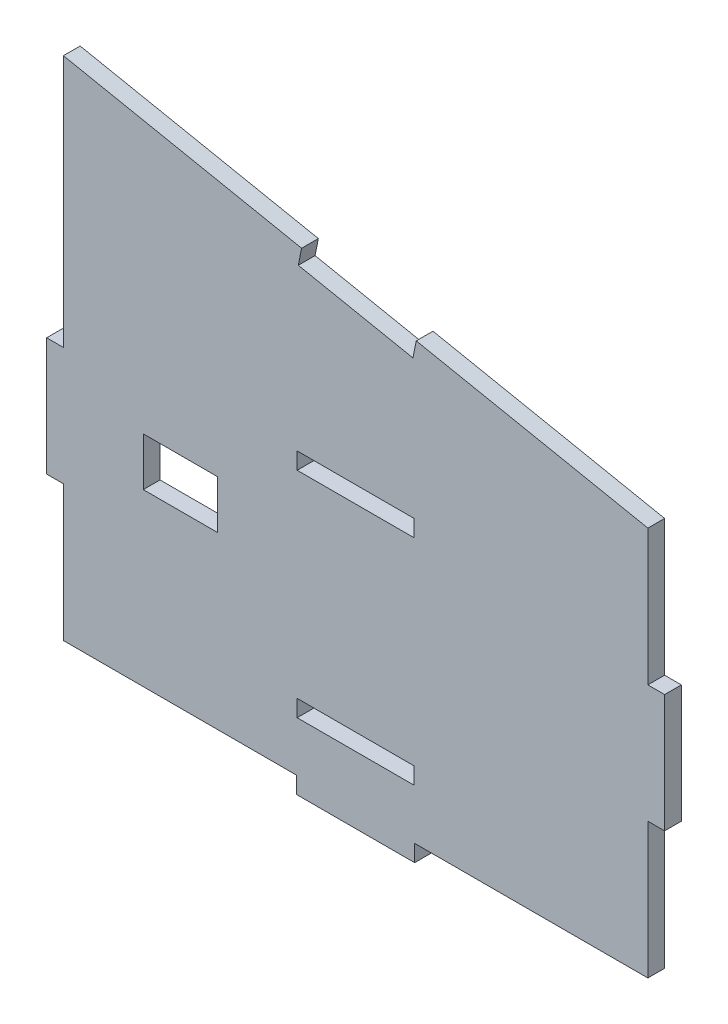
ISO-10303-21;
HEADER;
FILE_DESCRIPTION(('STEP AP214'),'2;1');
FILE_NAME('part.step','',(''),(''),'','','');
FILE_SCHEMA(('AUTOMOTIVE_DESIGN { 1 0 10303 214 1 1 1 1 }'));
ENDSEC;
DATA;
#1=APPLICATION_CONTEXT('core data for automotive mechanical design processes');
#2=APPLICATION_PROTOCOL_DEFINITION('international standard','automotive_design',2000,#1);
#3=PRODUCT_CONTEXT('',#1,'mechanical');
#4=PRODUCT('Part','Part','',(#3));
#5=PRODUCT_RELATED_PRODUCT_CATEGORY('part','',(#4));
#6=PRODUCT_DEFINITION_FORMATION('','',#4);
#7=PRODUCT_DEFINITION_CONTEXT('part definition',#1,'design');
#8=PRODUCT_DEFINITION('design','',#6,#7);
#9=PRODUCT_DEFINITION_SHAPE('','',#8);
#10=(LENGTH_UNIT() NAMED_UNIT(*) SI_UNIT(.MILLI.,.METRE.));
#11=(NAMED_UNIT(*) PLANE_ANGLE_UNIT() SI_UNIT($,.RADIAN.));
#12=(NAMED_UNIT(*) SI_UNIT($,.STERADIAN.) SOLID_ANGLE_UNIT());
#13=UNCERTAINTY_MEASURE_WITH_UNIT(LENGTH_MEASURE(1.E-05),#10,'distance_accuracy_value','');
#14=(GEOMETRIC_REPRESENTATION_CONTEXT(3) GLOBAL_UNCERTAINTY_ASSIGNED_CONTEXT((#13)) GLOBAL_UNIT_ASSIGNED_CONTEXT((#10,
#11,#12)) REPRESENTATION_CONTEXT('',''));
#15=CARTESIAN_POINT('',(0.,0.,0.));
#16=DIRECTION('',(0.,0.,1.));
#17=DIRECTION('',(1.,0.,0.));
#18=AXIS2_PLACEMENT_3D('',#15,#16,#17);
#19=CARTESIAN_POINT('',(0.,0.,4.3));
#20=DIRECTION('',(0.,0.,1.));
#21=DIRECTION('',(1.,0.,0.));
#22=AXIS2_PLACEMENT_3D('',#19,#20,#21);
#23=PLANE('',#22);
#24=DIRECTION('',(-0.98058067569092,0.196116135138184,0.));
#25=VECTOR('',#24,1.);
#26=CARTESIAN_POINT('',(61.1345892457303,117.773082150854,4.3));
#27=LINE('',#26,#25);
#28=CARTESIAN_POINT('',(61.1345892457303,117.773082150854,4.3));
#29=VERTEX_POINT('',#28);
#30=CARTESIAN_POINT('',(0.,130.,4.3));
#31=VERTEX_POINT('',#30);
#32=EDGE_CURVE('E343',#29,#31,#27,.T.);
#33=ORIENTED_EDGE('',*,*,#32,.T.);
#34=DIRECTION('',(0.,-1.,0.));
#35=VECTOR('',#34,1.);
#36=CARTESIAN_POINT('',(0.,130.,4.3));
#37=LINE('',#36,#35);
#38=CARTESIAN_POINT('',(0.,65.15,4.3));
#39=VERTEX_POINT('',#38);
#40=EDGE_CURVE('E346',#31,#39,#37,.T.);
#41=ORIENTED_EDGE('',*,*,#40,.T.);
#42=DIRECTION('',(-1.,0.,0.));
#43=VECTOR('',#42,1.);
#44=CARTESIAN_POINT('',(0.,65.15,4.3));
#45=LINE('',#44,#43);
#46=CARTESIAN_POINT('',(-4.3,65.15,4.3));
#47=VERTEX_POINT('',#46);
#48=EDGE_CURVE('E349',#39,#47,#45,.T.);
#49=ORIENTED_EDGE('',*,*,#48,.T.);
#50=DIRECTION('',(0.,-1.,0.));
#51=VECTOR('',#50,1.);
#52=CARTESIAN_POINT('',(-4.3,65.15,4.3));
#53=LINE('',#52,#51);
#54=CARTESIAN_POINT('',(-4.3,34.85,4.3));
#55=VERTEX_POINT('',#54);
#56=EDGE_CURVE('E351',#47,#55,#53,.T.);
#57=ORIENTED_EDGE('',*,*,#56,.T.);
#58=DIRECTION('',(1.,0.,0.));
#59=VECTOR('',#58,1.);
#60=CARTESIAN_POINT('',(0.,34.85,4.3));
#61=LINE('',#60,#59);
#62=CARTESIAN_POINT('',(0.,34.85,4.3));
#63=VERTEX_POINT('',#62);
#64=EDGE_CURVE('E353',#55,#63,#61,.T.);
#65=ORIENTED_EDGE('',*,*,#64,.T.);
#66=DIRECTION('',(0.,-1.,0.));
#67=VECTOR('',#66,1.);
#68=CARTESIAN_POINT('',(0.,34.85,4.3));
#69=LINE('',#68,#67);
#70=CARTESIAN_POINT('',(0.,0.,4.3));
#71=VERTEX_POINT('',#70);
#72=EDGE_CURVE('E355',#63,#71,#69,.T.);
#73=ORIENTED_EDGE('',*,*,#72,.T.);
#74=DIRECTION('',(1.,0.,0.));
#75=VECTOR('',#74,1.);
#76=CARTESIAN_POINT('',(0.,0.,4.3));
#77=LINE('',#76,#75);
#78=CARTESIAN_POINT('',(59.85,0.,4.3));
#79=VERTEX_POINT('',#78);
#80=EDGE_CURVE('E357',#71,#79,#77,.T.);
#81=ORIENTED_EDGE('',*,*,#80,.T.);
#82=DIRECTION('',(0.,-1.,0.));
#83=VECTOR('',#82,1.);
#84=CARTESIAN_POINT('',(59.85,0.,4.3));
#85=LINE('',#84,#83);
#86=CARTESIAN_POINT('',(59.85,-4.3,4.3));
#87=VERTEX_POINT('',#86);
#88=EDGE_CURVE('E359',#79,#87,#85,.T.);
#89=ORIENTED_EDGE('',*,*,#88,.T.);
#90=DIRECTION('',(1.,0.,0.));
#91=VECTOR('',#90,1.);
#92=CARTESIAN_POINT('',(90.15,-4.3,4.3));
#93=LINE('',#92,#91);
#94=CARTESIAN_POINT('',(90.15,-4.3,4.3));
#95=VERTEX_POINT('',#94);
#96=EDGE_CURVE('E361',#87,#95,#93,.T.);
#97=ORIENTED_EDGE('',*,*,#96,.T.);
#98=DIRECTION('',(0.,1.,0.));
#99=VECTOR('',#98,1.);
#100=CARTESIAN_POINT('',(90.15,0.,4.3));
#101=LINE('',#100,#99);
#102=CARTESIAN_POINT('',(90.15,0.,4.3));
#103=VERTEX_POINT('',#102);
#104=EDGE_CURVE('E363',#95,#103,#101,.T.);
#105=ORIENTED_EDGE('',*,*,#104,.T.);
#106=DIRECTION('',(1.,0.,0.));
#107=VECTOR('',#106,1.);
#108=CARTESIAN_POINT('',(90.15,0.,4.3));
#109=LINE('',#108,#107);
#110=CARTESIAN_POINT('',(150.,0.,4.3));
#111=VERTEX_POINT('',#110);
#112=EDGE_CURVE('E365',#103,#111,#109,.T.);
#113=ORIENTED_EDGE('',*,*,#112,.T.);
#114=DIRECTION('',(0.,1.,0.));
#115=VECTOR('',#114,1.);
#116=CARTESIAN_POINT('',(150.,0.,4.3));
#117=LINE('',#116,#115);
#118=CARTESIAN_POINT('',(150.,34.85,4.3));
#119=VERTEX_POINT('',#118);
#120=EDGE_CURVE('E367',#111,#119,#117,.T.);
#121=ORIENTED_EDGE('',*,*,#120,.T.);
#122=DIRECTION('',(1.,0.,0.));
#123=VECTOR('',#122,1.);
#124=CARTESIAN_POINT('',(150.,34.85,4.3));
#125=LINE('',#124,#123);
#126=CARTESIAN_POINT('',(154.3,34.85,4.3));
#127=VERTEX_POINT('',#126);
#128=EDGE_CURVE('E369',#119,#127,#125,.T.);
#129=ORIENTED_EDGE('',*,*,#128,.T.);
#130=DIRECTION('',(0.,1.,0.));
#131=VECTOR('',#130,1.);
#132=CARTESIAN_POINT('',(154.3,65.15,4.3));
#133=LINE('',#132,#131);
#134=CARTESIAN_POINT('',(154.3,65.15,4.3));
#135=VERTEX_POINT('',#134);
#136=EDGE_CURVE('E371',#127,#135,#133,.T.);
#137=ORIENTED_EDGE('',*,*,#136,.T.);
#138=DIRECTION('',(-1.,0.,0.));
#139=VECTOR('',#138,1.);
#140=CARTESIAN_POINT('',(150.,65.15,4.3));
#141=LINE('',#140,#139);
#142=CARTESIAN_POINT('',(150.,65.15,4.3));
#143=VERTEX_POINT('',#142);
#144=EDGE_CURVE('E373',#135,#143,#141,.T.);
#145=ORIENTED_EDGE('',*,*,#144,.T.);
#146=DIRECTION('',(0.,1.,0.));
#147=VECTOR('',#146,1.);
#148=CARTESIAN_POINT('',(150.,65.15,4.3));
#149=LINE('',#148,#147);
#150=CARTESIAN_POINT('',(150.,100.,4.3));
#151=VERTEX_POINT('',#150);
#152=EDGE_CURVE('E375',#143,#151,#149,.T.);
#153=ORIENTED_EDGE('',*,*,#152,.T.);
#154=DIRECTION('',(-0.98058067569092,0.196116135138184,0.));
#155=VECTOR('',#154,1.);
#156=CARTESIAN_POINT('',(150.,100.,4.3));
#157=LINE('',#156,#155);
#158=CARTESIAN_POINT('',(90.5520095164579,111.889598096708,4.3));
#159=VERTEX_POINT('',#158);
#160=EDGE_CURVE('E377',#151,#159,#157,.T.);
#161=ORIENTED_EDGE('',*,*,#160,.T.);
#162=DIRECTION('',(-0.196116135138183,-0.98058067569092,0.));
#163=VECTOR('',#162,1.);
#164=CARTESIAN_POINT('',(90.5520095164579,111.889598096708,4.3));
#165=LINE('',#164,#163);
#166=CARTESIAN_POINT('',(89.7087101353637,107.673101191237,4.3));
#167=VERTEX_POINT('',#166);
#168=EDGE_CURVE('E379',#159,#167,#165,.T.);
#169=ORIENTED_EDGE('',*,*,#168,.T.);
#170=DIRECTION('',(-0.98058067569092,0.196116135138184,0.));
#171=VECTOR('',#170,1.);
#172=CARTESIAN_POINT('',(89.7087101353637,107.673101191237,4.3));
#173=LINE('',#172,#171);
#174=CARTESIAN_POINT('',(60.2912898646361,113.556585245383,4.3));
#175=VERTEX_POINT('',#174);
#176=EDGE_CURVE('E381',#167,#175,#173,.T.);
#177=ORIENTED_EDGE('',*,*,#176,.T.);
#178=DIRECTION('',(0.196116135138188,0.980580675690919,0.));
#179=VECTOR('',#178,1.);
#180=CARTESIAN_POINT('',(61.1345892457303,117.773082150854,4.3));
#181=LINE('',#180,#179);
#182=EDGE_CURVE('E383',#175,#29,#181,.T.);
#183=ORIENTED_EDGE('',*,*,#182,.T.);
#184=EDGE_LOOP('',(#33,#41,#49,#57,#65,#73,#81,#89,#97,#105,#113,#121,#129,#137,#145,#153,#161,
#169,#177,#183));
#185=FACE_BOUND('',#184,.T.);
#186=DIRECTION('',(-1.,0.,0.));
#187=VECTOR('',#186,1.);
#188=CARTESIAN_POINT('',(60.,17.15,4.3));
#189=LINE('',#188,#187);
#190=CARTESIAN_POINT('',(90.,17.15,4.3));
#191=VERTEX_POINT('',#190);
#192=CARTESIAN_POINT('',(60.,17.15,4.3));
#193=VERTEX_POINT('',#192);
#194=EDGE_CURVE('E314',#191,#193,#189,.T.);
#195=ORIENTED_EDGE('',*,*,#194,.F.);
#196=DIRECTION('',(0.,1.,0.));
#197=VECTOR('',#196,1.);
#198=CARTESIAN_POINT('',(90.,17.15,4.3));
#199=LINE('',#198,#197);
#200=CARTESIAN_POINT('',(90.,12.85,4.3));
#201=VERTEX_POINT('',#200);
#202=EDGE_CURVE('E312',#201,#191,#199,.T.);
#203=ORIENTED_EDGE('',*,*,#202,.F.);
#204=DIRECTION('',(1.,0.,0.));
#205=VECTOR('',#204,1.);
#206=CARTESIAN_POINT('',(60.,12.85,4.3));
#207=LINE('',#206,#205);
#208=CARTESIAN_POINT('',(60.,12.85,4.3));
#209=VERTEX_POINT('',#208);
#210=EDGE_CURVE('E320',#209,#201,#207,.T.);
#211=ORIENTED_EDGE('',*,*,#210,.F.);
#212=DIRECTION('',(0.,-1.,0.));
#213=VECTOR('',#212,1.);
#214=CARTESIAN_POINT('',(60.,17.15,4.3));
#215=LINE('',#214,#213);
#216=EDGE_CURVE('E317',#193,#209,#215,.T.);
#217=ORIENTED_EDGE('',*,*,#216,.F.);
#218=EDGE_LOOP('',(#195,#203,#211,#217));
#219=FACE_BOUND('',#218,.T.);
#220=DIRECTION('',(-1.,0.,0.));
#221=VECTOR('',#220,1.);
#222=CARTESIAN_POINT('',(59.9999999999999,72.15,4.3));
#223=LINE('',#222,#221);
#224=CARTESIAN_POINT('',(89.9999999999999,72.15,4.3));
#225=VERTEX_POINT('',#224);
#226=CARTESIAN_POINT('',(59.9999999999999,72.15,4.3));
#227=VERTEX_POINT('',#226);
#228=EDGE_CURVE('E283',#225,#227,#223,.T.);
#229=ORIENTED_EDGE('',*,*,#228,.F.);
#230=DIRECTION('',(0.,1.,0.));
#231=VECTOR('',#230,1.);
#232=CARTESIAN_POINT('',(89.9999999999999,72.15,4.3));
#233=LINE('',#232,#231);
#234=CARTESIAN_POINT('',(89.9999999999999,67.85,4.3));
#235=VERTEX_POINT('',#234);
#236=EDGE_CURVE('E281',#235,#225,#233,.T.);
#237=ORIENTED_EDGE('',*,*,#236,.F.);
#238=DIRECTION('',(1.,0.,0.));
#239=VECTOR('',#238,1.);
#240=CARTESIAN_POINT('',(59.9999999999999,67.85,4.3));
#241=LINE('',#240,#239);
#242=CARTESIAN_POINT('',(59.9999999999999,67.85,4.3));
#243=VERTEX_POINT('',#242);
#244=EDGE_CURVE('E289',#243,#235,#241,.T.);
#245=ORIENTED_EDGE('',*,*,#244,.F.);
#246=DIRECTION('',(0.,-1.,0.));
#247=VECTOR('',#246,1.);
#248=CARTESIAN_POINT('',(59.9999999999999,72.15,4.3));
#249=LINE('',#248,#247);
#250=EDGE_CURVE('E286',#227,#243,#249,.T.);
#251=ORIENTED_EDGE('',*,*,#250,.F.);
#252=EDGE_LOOP('',(#229,#237,#245,#251));
#253=FACE_BOUND('',#252,.T.);
#254=DIRECTION('',(1.,0.,0.));
#255=VECTOR('',#254,1.);
#256=CARTESIAN_POINT('',(39.5,43.8,4.3));
#257=LINE('',#256,#255);
#258=CARTESIAN_POINT('',(20.5,43.8,4.3));
#259=VERTEX_POINT('',#258);
#260=CARTESIAN_POINT('',(39.5,43.8,4.3));
#261=VERTEX_POINT('',#260);
#262=EDGE_CURVE('E253',#259,#261,#257,.T.);
#263=ORIENTED_EDGE('',*,*,#262,.F.);
#264=DIRECTION('',(0.,-1.,0.));
#265=VECTOR('',#264,1.);
#266=CARTESIAN_POINT('',(20.5,43.8,4.3));
#267=LINE('',#266,#265);
#268=CARTESIAN_POINT('',(20.5,56.2,4.3));
#269=VERTEX_POINT('',#268);
#270=EDGE_CURVE('E245',#269,#259,#267,.T.);
#271=ORIENTED_EDGE('',*,*,#270,.F.);
#272=DIRECTION('',(-1.,0.,0.));
#273=VECTOR('',#272,1.);
#274=CARTESIAN_POINT('',(39.5,56.2,4.3));
#275=LINE('',#274,#273);
#276=CARTESIAN_POINT('',(39.5,56.2,4.3));
#277=VERTEX_POINT('',#276);
#278=EDGE_CURVE('E267',#277,#269,#275,.T.);
#279=ORIENTED_EDGE('',*,*,#278,.F.);
#280=DIRECTION('',(0.,1.,0.));
#281=VECTOR('',#280,1.);
#282=CARTESIAN_POINT('',(39.5,43.8,4.3));
#283=LINE('',#282,#281);
#284=EDGE_CURVE('E265',#261,#277,#283,.T.);
#285=ORIENTED_EDGE('',*,*,#284,.F.);
#286=EDGE_LOOP('',(#263,#271,#279,#285));
#287=FACE_BOUND('',#286,.T.);
#288=ADVANCED_FACE('F36',(#185,#219,#253,#287),#23,.T.);
#289=CARTESIAN_POINT('',(0.,0.,0.));
#290=DIRECTION('',(0.,0.,1.));
#291=DIRECTION('',(1.,0.,0.));
#292=AXIS2_PLACEMENT_3D('',#289,#290,#291);
#293=PLANE('',#292);
#294=DIRECTION('',(0.,1.,0.));
#295=VECTOR('',#294,1.);
#296=CARTESIAN_POINT('',(89.9999999999999,72.15,0.));
#297=LINE('',#296,#295);
#298=CARTESIAN_POINT('',(89.9999999999999,67.85,0.));
#299=VERTEX_POINT('',#298);
#300=CARTESIAN_POINT('',(89.9999999999999,72.15,0.));
#301=VERTEX_POINT('',#300);
#302=EDGE_CURVE('E261',#299,#301,#297,.T.);
#303=ORIENTED_EDGE('',*,*,#302,.T.);
#304=DIRECTION('',(-1.,0.,0.));
#305=VECTOR('',#304,1.);
#306=CARTESIAN_POINT('',(59.9999999999999,72.15,0.));
#307=LINE('',#306,#305);
#308=CARTESIAN_POINT('',(59.9999999999999,72.15,0.));
#309=VERTEX_POINT('',#308);
#310=EDGE_CURVE('E294',#301,#309,#307,.T.);
#311=ORIENTED_EDGE('',*,*,#310,.T.);
#312=DIRECTION('',(0.,-1.,0.));
#313=VECTOR('',#312,1.);
#314=CARTESIAN_POINT('',(59.9999999999999,72.15,0.));
#315=LINE('',#314,#313);
#316=CARTESIAN_POINT('',(59.9999999999999,67.85,0.));
#317=VERTEX_POINT('',#316);
#318=EDGE_CURVE('E297',#309,#317,#315,.T.);
#319=ORIENTED_EDGE('',*,*,#318,.T.);
#320=DIRECTION('',(1.,0.,0.));
#321=VECTOR('',#320,1.);
#322=CARTESIAN_POINT('',(59.9999999999999,67.85,0.));
#323=LINE('',#322,#321);
#324=EDGE_CURVE('E284',#317,#299,#323,.T.);
#325=ORIENTED_EDGE('',*,*,#324,.T.);
#326=EDGE_LOOP('',(#303,#311,#319,#325));
#327=FACE_BOUND('',#326,.T.);
#328=DIRECTION('',(-0.98058067569092,0.196116135138184,0.));
#329=VECTOR('',#328,1.);
#330=CARTESIAN_POINT('',(61.1345892457303,117.773082150854,0.));
#331=LINE('',#330,#329);
#332=CARTESIAN_POINT('',(61.1345892457303,117.773082150854,0.));
#333=VERTEX_POINT('',#332);
#334=CARTESIAN_POINT('',(0.,130.,0.));
#335=VERTEX_POINT('',#334);
#336=EDGE_CURVE('E342',#333,#335,#331,.T.);
#337=ORIENTED_EDGE('',*,*,#336,.F.);
#338=DIRECTION('',(0.196116135138188,0.980580675690919,0.));
#339=VECTOR('',#338,1.);
#340=CARTESIAN_POINT('',(61.1345892457303,117.773082150854,0.));
#341=LINE('',#340,#339);
#342=CARTESIAN_POINT('',(60.2912898646361,113.556585245383,0.));
#343=VERTEX_POINT('',#342);
#344=EDGE_CURVE('E347',#343,#333,#341,.T.);
#345=ORIENTED_EDGE('',*,*,#344,.F.);
#346=DIRECTION('',(-0.98058067569092,0.196116135138184,0.));
#347=VECTOR('',#346,1.);
#348=CARTESIAN_POINT('',(89.7087101353637,107.673101191237,0.));
#349=LINE('',#348,#347);
#350=CARTESIAN_POINT('',(89.7087101353637,107.673101191237,0.));
#351=VERTEX_POINT('',#350);
#352=EDGE_CURVE('E422',#351,#343,#349,.T.);
#353=ORIENTED_EDGE('',*,*,#352,.F.);
#354=DIRECTION('',(-0.196116135138183,-0.98058067569092,0.));
#355=VECTOR('',#354,1.);
#356=CARTESIAN_POINT('',(90.5520095164579,111.889598096708,0.));
#357=LINE('',#356,#355);
#358=CARTESIAN_POINT('',(90.5520095164579,111.889598096708,0.));
#359=VERTEX_POINT('',#358);
#360=EDGE_CURVE('E420',#359,#351,#357,.T.);
#361=ORIENTED_EDGE('',*,*,#360,.F.);
#362=DIRECTION('',(-0.98058067569092,0.196116135138184,0.));
#363=VECTOR('',#362,1.);
#364=CARTESIAN_POINT('',(150.,100.,0.));
#365=LINE('',#364,#363);
#366=CARTESIAN_POINT('',(150.,100.,0.));
#367=VERTEX_POINT('',#366);
#368=EDGE_CURVE('E418',#367,#359,#365,.T.);
#369=ORIENTED_EDGE('',*,*,#368,.F.);
#370=DIRECTION('',(0.,1.,0.));
#371=VECTOR('',#370,1.);
#372=CARTESIAN_POINT('',(150.,65.15,0.));
#373=LINE('',#372,#371);
#374=CARTESIAN_POINT('',(150.,65.15,0.));
#375=VERTEX_POINT('',#374);
#376=EDGE_CURVE('E416',#375,#367,#373,.T.);
#377=ORIENTED_EDGE('',*,*,#376,.F.);
#378=DIRECTION('',(-1.,0.,0.));
#379=VECTOR('',#378,1.);
#380=CARTESIAN_POINT('',(150.,65.15,0.));
#381=LINE('',#380,#379);
#382=CARTESIAN_POINT('',(154.3,65.15,0.));
#383=VERTEX_POINT('',#382);
#384=EDGE_CURVE('E414',#383,#375,#381,.T.);
#385=ORIENTED_EDGE('',*,*,#384,.F.);
#386=DIRECTION('',(0.,1.,0.));
#387=VECTOR('',#386,1.);
#388=CARTESIAN_POINT('',(154.3,65.15,0.));
#389=LINE('',#388,#387);
#390=CARTESIAN_POINT('',(154.3,34.85,0.));
#391=VERTEX_POINT('',#390);
#392=EDGE_CURVE('E412',#391,#383,#389,.T.);
#393=ORIENTED_EDGE('',*,*,#392,.F.);
#394=DIRECTION('',(1.,0.,0.));
#395=VECTOR('',#394,1.);
#396=CARTESIAN_POINT('',(150.,34.85,0.));
#397=LINE('',#396,#395);
#398=CARTESIAN_POINT('',(150.,34.85,0.));
#399=VERTEX_POINT('',#398);
#400=EDGE_CURVE('E410',#399,#391,#397,.T.);
#401=ORIENTED_EDGE('',*,*,#400,.F.);
#402=DIRECTION('',(0.,1.,0.));
#403=VECTOR('',#402,1.);
#404=CARTESIAN_POINT('',(150.,0.,0.));
#405=LINE('',#404,#403);
#406=CARTESIAN_POINT('',(150.,0.,0.));
#407=VERTEX_POINT('',#406);
#408=EDGE_CURVE('E408',#407,#399,#405,.T.);
#409=ORIENTED_EDGE('',*,*,#408,.F.);
#410=DIRECTION('',(1.,0.,0.));
#411=VECTOR('',#410,1.);
#412=CARTESIAN_POINT('',(90.15,0.,0.));
#413=LINE('',#412,#411);
#414=CARTESIAN_POINT('',(90.15,0.,0.));
#415=VERTEX_POINT('',#414);
#416=EDGE_CURVE('E406',#415,#407,#413,.T.);
#417=ORIENTED_EDGE('',*,*,#416,.F.);
#418=DIRECTION('',(0.,1.,0.));
#419=VECTOR('',#418,1.);
#420=CARTESIAN_POINT('',(90.15,0.,0.));
#421=LINE('',#420,#419);
#422=CARTESIAN_POINT('',(90.15,-4.3,0.));
#423=VERTEX_POINT('',#422);
#424=EDGE_CURVE('E404',#423,#415,#421,.T.);
#425=ORIENTED_EDGE('',*,*,#424,.F.);
#426=DIRECTION('',(1.,0.,0.));
#427=VECTOR('',#426,1.);
#428=CARTESIAN_POINT('',(90.15,-4.3,0.));
#429=LINE('',#428,#427);
#430=CARTESIAN_POINT('',(59.85,-4.3,0.));
#431=VERTEX_POINT('',#430);
#432=EDGE_CURVE('E402',#431,#423,#429,.T.);
#433=ORIENTED_EDGE('',*,*,#432,.F.);
#434=DIRECTION('',(0.,-1.,0.));
#435=VECTOR('',#434,1.);
#436=CARTESIAN_POINT('',(59.85,0.,0.));
#437=LINE('',#436,#435);
#438=CARTESIAN_POINT('',(59.85,0.,0.));
#439=VERTEX_POINT('',#438);
#440=EDGE_CURVE('E400',#439,#431,#437,.T.);
#441=ORIENTED_EDGE('',*,*,#440,.F.);
#442=DIRECTION('',(1.,0.,0.));
#443=VECTOR('',#442,1.);
#444=CARTESIAN_POINT('',(0.,0.,0.));
#445=LINE('',#444,#443);
#446=CARTESIAN_POINT('',(0.,0.,0.));
#447=VERTEX_POINT('',#446);
#448=EDGE_CURVE('E398',#447,#439,#445,.T.);
#449=ORIENTED_EDGE('',*,*,#448,.F.);
#450=DIRECTION('',(0.,-1.,0.));
#451=VECTOR('',#450,1.);
#452=CARTESIAN_POINT('',(0.,34.85,0.));
#453=LINE('',#452,#451);
#454=CARTESIAN_POINT('',(0.,34.85,0.));
#455=VERTEX_POINT('',#454);
#456=EDGE_CURVE('E396',#455,#447,#453,.T.);
#457=ORIENTED_EDGE('',*,*,#456,.F.);
#458=DIRECTION('',(1.,0.,0.));
#459=VECTOR('',#458,1.);
#460=CARTESIAN_POINT('',(0.,34.85,0.));
#461=LINE('',#460,#459);
#462=CARTESIAN_POINT('',(-4.3,34.85,0.));
#463=VERTEX_POINT('',#462);
#464=EDGE_CURVE('E394',#463,#455,#461,.T.);
#465=ORIENTED_EDGE('',*,*,#464,.F.);
#466=DIRECTION('',(0.,-1.,0.));
#467=VECTOR('',#466,1.);
#468=CARTESIAN_POINT('',(-4.3,65.15,0.));
#469=LINE('',#468,#467);
#470=CARTESIAN_POINT('',(-4.3,65.15,0.));
#471=VERTEX_POINT('',#470);
#472=EDGE_CURVE('E392',#471,#463,#469,.T.);
#473=ORIENTED_EDGE('',*,*,#472,.F.);
#474=DIRECTION('',(-1.,0.,0.));
#475=VECTOR('',#474,1.);
#476=CARTESIAN_POINT('',(0.,65.15,0.));
#477=LINE('',#476,#475);
#478=CARTESIAN_POINT('',(0.,65.15,0.));
#479=VERTEX_POINT('',#478);
#480=EDGE_CURVE('E390',#479,#471,#477,.T.);
#481=ORIENTED_EDGE('',*,*,#480,.F.);
#482=DIRECTION('',(0.,-1.,0.));
#483=VECTOR('',#482,1.);
#484=CARTESIAN_POINT('',(0.,130.,0.));
#485=LINE('',#484,#483);
#486=EDGE_CURVE('E388',#335,#479,#485,.T.);
#487=ORIENTED_EDGE('',*,*,#486,.F.);
#488=EDGE_LOOP('',(#337,#345,#353,#361,#369,#377,#385,#393,#401,#409,#417,#425,#433,#441,#449,
#457,#465,#473,#481,#487));
#489=FACE_BOUND('',#488,.T.);
#490=DIRECTION('',(0.,1.,0.));
#491=VECTOR('',#490,1.);
#492=CARTESIAN_POINT('',(90.,17.15,0.));
#493=LINE('',#492,#491);
#494=CARTESIAN_POINT('',(90.,12.85,0.));
#495=VERTEX_POINT('',#494);
#496=CARTESIAN_POINT('',(90.,17.15,0.));
#497=VERTEX_POINT('',#496);
#498=EDGE_CURVE('E311',#495,#497,#493,.T.);
#499=ORIENTED_EDGE('',*,*,#498,.T.);
#500=DIRECTION('',(-1.,0.,0.));
#501=VECTOR('',#500,1.);
#502=CARTESIAN_POINT('',(60.,17.15,0.));
#503=LINE('',#502,#501);
#504=CARTESIAN_POINT('',(60.,17.15,0.));
#505=VERTEX_POINT('',#504);
#506=EDGE_CURVE('E325',#497,#505,#503,.T.);
#507=ORIENTED_EDGE('',*,*,#506,.T.);
#508=DIRECTION('',(0.,-1.,0.));
#509=VECTOR('',#508,1.);
#510=CARTESIAN_POINT('',(60.,17.15,0.));
#511=LINE('',#510,#509);
#512=CARTESIAN_POINT('',(60.,12.85,0.));
#513=VERTEX_POINT('',#512);
#514=EDGE_CURVE('E328',#505,#513,#511,.T.);
#515=ORIENTED_EDGE('',*,*,#514,.T.);
#516=DIRECTION('',(1.,0.,0.));
#517=VECTOR('',#516,1.);
#518=CARTESIAN_POINT('',(60.,12.85,0.));
#519=LINE('',#518,#517);
#520=EDGE_CURVE('E315',#513,#495,#519,.T.);
#521=ORIENTED_EDGE('',*,*,#520,.T.);
#522=EDGE_LOOP('',(#499,#507,#515,#521));
#523=FACE_BOUND('',#522,.T.);
#524=DIRECTION('',(0.,-1.,0.));
#525=VECTOR('',#524,1.);
#526=CARTESIAN_POINT('',(20.5,43.8,0.));
#527=LINE('',#526,#525);
#528=CARTESIAN_POINT('',(20.5,56.2,0.));
#529=VERTEX_POINT('',#528);
#530=CARTESIAN_POINT('',(20.5,43.8,0.));
#531=VERTEX_POINT('',#530);
#532=EDGE_CURVE('E59',#529,#531,#527,.T.);
#533=ORIENTED_EDGE('',*,*,#532,.T.);
#534=DIRECTION('',(1.,0.,0.));
#535=VECTOR('',#534,1.);
#536=CARTESIAN_POINT('',(39.5,43.8,0.));
#537=LINE('',#536,#535);
#538=CARTESIAN_POINT('',(39.5,43.8,0.));
#539=VERTEX_POINT('',#538);
#540=EDGE_CURVE('E260',#531,#539,#537,.T.);
#541=ORIENTED_EDGE('',*,*,#540,.T.);
#542=DIRECTION('',(0.,1.,0.));
#543=VECTOR('',#542,1.);
#544=CARTESIAN_POINT('',(39.5,43.8,0.));
#545=LINE('',#544,#543);
#546=CARTESIAN_POINT('',(39.5,56.2,0.));
#547=VERTEX_POINT('',#546);
#548=EDGE_CURVE('E273',#539,#547,#545,.T.);
#549=ORIENTED_EDGE('',*,*,#548,.T.);
#550=DIRECTION('',(-1.,0.,0.));
#551=VECTOR('',#550,1.);
#552=CARTESIAN_POINT('',(39.5,56.2,0.));
#553=LINE('',#552,#551);
#554=EDGE_CURVE('E254',#547,#529,#553,.T.);
#555=ORIENTED_EDGE('',*,*,#554,.T.);
#556=EDGE_LOOP('',(#533,#541,#549,#555));
#557=FACE_BOUND('',#556,.T.);
#558=ADVANCED_FACE('F488',(#327,#489,#523,#557),#293,.F.);
#559=CARTESIAN_POINT('',(61.1345892457303,117.773082150854,4.3));
#560=DIRECTION('',(-0.196116135138184,-0.98058067569092,0.));
#561=DIRECTION('',(0.98058067569092,-0.196116135138184,0.));
#562=AXIS2_PLACEMENT_3D('',#559,#560,#561);
#563=PLANE('',#562);
#564=ORIENTED_EDGE('',*,*,#336,.T.);
#565=DIRECTION('',(0.,0.,-1.));
#566=VECTOR('',#565,1.);
#567=CARTESIAN_POINT('',(0.,130.,4.3));
#568=LINE('',#567,#566);
#569=EDGE_CURVE('E11',#31,#335,#568,.T.);
#570=ORIENTED_EDGE('',*,*,#569,.F.);
#571=ORIENTED_EDGE('',*,*,#32,.F.);
#572=DIRECTION('',(0.,0.,-1.));
#573=VECTOR('',#572,1.);
#574=CARTESIAN_POINT('',(61.1345892457303,117.773082150854,4.3));
#575=LINE('',#574,#573);
#576=EDGE_CURVE('E385',#29,#333,#575,.T.);
#577=ORIENTED_EDGE('',*,*,#576,.T.);
#578=EDGE_LOOP('',(#564,#570,#571,#577));
#579=FACE_BOUND('',#578,.T.);
#580=ADVANCED_FACE('F38',(#579),#563,.F.);
#581=CARTESIAN_POINT('',(0.,130.,4.3));
#582=DIRECTION('',(1.,0.,0.));
#583=DIRECTION('',(0.,1.,0.));
#584=AXIS2_PLACEMENT_3D('',#581,#582,#583);
#585=PLANE('',#584);
#586=ORIENTED_EDGE('',*,*,#486,.T.);
#587=DIRECTION('',(0.,0.,-1.));
#588=VECTOR('',#587,1.);
#589=CARTESIAN_POINT('',(0.,65.15,4.3));
#590=LINE('',#589,#588);
#591=EDGE_CURVE('E44',#39,#479,#590,.T.);
#592=ORIENTED_EDGE('',*,*,#591,.F.);
#593=ORIENTED_EDGE('',*,*,#40,.F.);
#594=ORIENTED_EDGE('',*,*,#569,.T.);
#595=EDGE_LOOP('',(#586,#592,#593,#594));
#596=FACE_BOUND('',#595,.T.);
#597=ADVANCED_FACE('F506',(#596),#585,.F.);
#598=CARTESIAN_POINT('',(0.,65.15,4.3));
#599=DIRECTION('',(0.,-1.,0.));
#600=DIRECTION('',(0.,0.,-1.));
#601=AXIS2_PLACEMENT_3D('',#598,#599,#600);
#602=PLANE('',#601);
#603=ORIENTED_EDGE('',*,*,#480,.T.);
#604=DIRECTION('',(0.,0.,-1.));
#605=VECTOR('',#604,1.);
#606=CARTESIAN_POINT('',(-4.3,65.15,4.3));
#607=LINE('',#606,#605);
#608=EDGE_CURVE('E475',#47,#471,#607,.T.);
#609=ORIENTED_EDGE('',*,*,#608,.F.);
#610=ORIENTED_EDGE('',*,*,#48,.F.);
#611=ORIENTED_EDGE('',*,*,#591,.T.);
#612=EDGE_LOOP('',(#603,#609,#610,#611));
#613=FACE_BOUND('',#612,.T.);
#614=ADVANCED_FACE('F482',(#613),#602,.F.);
#615=CARTESIAN_POINT('',(-4.3,65.15,4.3));
#616=DIRECTION('',(1.,0.,0.));
#617=DIRECTION('',(0.,0.,-1.));
#618=AXIS2_PLACEMENT_3D('',#615,#616,#617);
#619=PLANE('',#618);
#620=ORIENTED_EDGE('',*,*,#472,.T.);
#621=DIRECTION('',(0.,0.,-1.));
#622=VECTOR('',#621,1.);
#623=CARTESIAN_POINT('',(-4.3,34.85,4.3));
#624=LINE('',#623,#622);
#625=EDGE_CURVE('E472',#55,#463,#624,.T.);
#626=ORIENTED_EDGE('',*,*,#625,.F.);
#627=ORIENTED_EDGE('',*,*,#56,.F.);
#628=ORIENTED_EDGE('',*,*,#608,.T.);
#629=EDGE_LOOP('',(#620,#626,#627,#628));
#630=FACE_BOUND('',#629,.T.);
#631=ADVANCED_FACE('F494',(#630),#619,.F.);
#632=CARTESIAN_POINT('',(0.,34.85,4.3));
#633=DIRECTION('',(0.,1.,0.));
#634=DIRECTION('',(0.,0.,1.));
#635=AXIS2_PLACEMENT_3D('',#632,#633,#634);
#636=PLANE('',#635);
#637=ORIENTED_EDGE('',*,*,#464,.T.);
#638=DIRECTION('',(0.,0.,-1.));
#639=VECTOR('',#638,1.);
#640=CARTESIAN_POINT('',(0.,34.85,4.3));
#641=LINE('',#640,#639);
#642=EDGE_CURVE('E469',#63,#455,#641,.T.);
#643=ORIENTED_EDGE('',*,*,#642,.F.);
#644=ORIENTED_EDGE('',*,*,#64,.F.);
#645=ORIENTED_EDGE('',*,*,#625,.T.);
#646=EDGE_LOOP('',(#637,#643,#644,#645));
#647=FACE_BOUND('',#646,.T.);
#648=ADVANCED_FACE('F498',(#647),#636,.F.);
#649=CARTESIAN_POINT('',(0.,34.85,4.3));
#650=DIRECTION('',(1.,0.,0.));
#651=DIRECTION('',(0.,1.,0.));
#652=AXIS2_PLACEMENT_3D('',#649,#650,#651);
#653=PLANE('',#652);
#654=ORIENTED_EDGE('',*,*,#456,.T.);
#655=DIRECTION('',(0.,0.,-1.));
#656=VECTOR('',#655,1.);
#657=CARTESIAN_POINT('',(0.,0.,4.3));
#658=LINE('',#657,#656);
#659=EDGE_CURVE('E466',#71,#447,#658,.T.);
#660=ORIENTED_EDGE('',*,*,#659,.F.);
#661=ORIENTED_EDGE('',*,*,#72,.F.);
#662=ORIENTED_EDGE('',*,*,#642,.T.);
#663=EDGE_LOOP('',(#654,#660,#661,#662));
#664=FACE_BOUND('',#663,.T.);
#665=ADVANCED_FACE('F579',(#664),#653,.F.);
#666=CARTESIAN_POINT('',(0.,0.,4.3));
#667=DIRECTION('',(0.,1.,0.));
#668=DIRECTION('',(0.,0.,1.));
#669=AXIS2_PLACEMENT_3D('',#666,#667,#668);
#670=PLANE('',#669);
#671=ORIENTED_EDGE('',*,*,#448,.T.);
#672=DIRECTION('',(0.,0.,-1.));
#673=VECTOR('',#672,1.);
#674=CARTESIAN_POINT('',(59.85,0.,4.3));
#675=LINE('',#674,#673);
#676=EDGE_CURVE('E463',#79,#439,#675,.T.);
#677=ORIENTED_EDGE('',*,*,#676,.F.);
#678=ORIENTED_EDGE('',*,*,#80,.F.);
#679=ORIENTED_EDGE('',*,*,#659,.T.);
#680=EDGE_LOOP('',(#671,#677,#678,#679));
#681=FACE_BOUND('',#680,.T.);
#682=ADVANCED_FACE('F577',(#681),#670,.F.);
#683=CARTESIAN_POINT('',(59.85,0.,4.3));
#684=DIRECTION('',(1.,0.,0.));
#685=DIRECTION('',(0.,0.,-1.));
#686=AXIS2_PLACEMENT_3D('',#683,#684,#685);
#687=PLANE('',#686);
#688=ORIENTED_EDGE('',*,*,#440,.T.);
#689=DIRECTION('',(0.,0.,-1.));
#690=VECTOR('',#689,1.);
#691=CARTESIAN_POINT('',(59.85,-4.3,4.3));
#692=LINE('',#691,#690);
#693=EDGE_CURVE('E460',#87,#431,#692,.T.);
#694=ORIENTED_EDGE('',*,*,#693,.F.);
#695=ORIENTED_EDGE('',*,*,#88,.F.);
#696=ORIENTED_EDGE('',*,*,#676,.T.);
#697=EDGE_LOOP('',(#688,#694,#695,#696));
#698=FACE_BOUND('',#697,.T.);
#699=ADVANCED_FACE('F572',(#698),#687,.F.);
#700=CARTESIAN_POINT('',(90.15,-4.3,4.3));
#701=DIRECTION('',(0.,1.,0.));
#702=DIRECTION('',(0.,0.,1.));
#703=AXIS2_PLACEMENT_3D('',#700,#701,#702);
#704=PLANE('',#703);
#705=ORIENTED_EDGE('',*,*,#432,.T.);
#706=DIRECTION('',(0.,0.,-1.));
#707=VECTOR('',#706,1.);
#708=CARTESIAN_POINT('',(90.15,-4.3,4.3));
#709=LINE('',#708,#707);
#710=EDGE_CURVE('E457',#95,#423,#709,.T.);
#711=ORIENTED_EDGE('',*,*,#710,.F.);
#712=ORIENTED_EDGE('',*,*,#96,.F.);
#713=ORIENTED_EDGE('',*,*,#693,.T.);
#714=EDGE_LOOP('',(#705,#711,#712,#713));
#715=FACE_BOUND('',#714,.T.);
#716=ADVANCED_FACE('F567',(#715),#704,.F.);
#717=CARTESIAN_POINT('',(90.15,0.,4.3));
#718=DIRECTION('',(-1.,0.,0.));
#719=DIRECTION('',(0.,-1.,0.));
#720=AXIS2_PLACEMENT_3D('',#717,#718,#719);
#721=PLANE('',#720);
#722=ORIENTED_EDGE('',*,*,#424,.T.);
#723=DIRECTION('',(0.,0.,-1.));
#724=VECTOR('',#723,1.);
#725=CARTESIAN_POINT('',(90.15,0.,4.3));
#726=LINE('',#725,#724);
#727=EDGE_CURVE('E454',#103,#415,#726,.T.);
#728=ORIENTED_EDGE('',*,*,#727,.F.);
#729=ORIENTED_EDGE('',*,*,#104,.F.);
#730=ORIENTED_EDGE('',*,*,#710,.T.);
#731=EDGE_LOOP('',(#722,#728,#729,#730));
#732=FACE_BOUND('',#731,.T.);
#733=ADVANCED_FACE('F563',(#732),#721,.F.);
#734=CARTESIAN_POINT('',(90.15,0.,4.3));
#735=DIRECTION('',(0.,1.,0.));
#736=DIRECTION('',(-1.,0.,0.));
#737=AXIS2_PLACEMENT_3D('',#734,#735,#736);
#738=PLANE('',#737);
#739=ORIENTED_EDGE('',*,*,#416,.T.);
#740=DIRECTION('',(0.,0.,-1.));
#741=VECTOR('',#740,1.);
#742=CARTESIAN_POINT('',(150.,0.,4.3));
#743=LINE('',#742,#741);
#744=EDGE_CURVE('E451',#111,#407,#743,.T.);
#745=ORIENTED_EDGE('',*,*,#744,.F.);
#746=ORIENTED_EDGE('',*,*,#112,.F.);
#747=ORIENTED_EDGE('',*,*,#727,.T.);
#748=EDGE_LOOP('',(#739,#745,#746,#747));
#749=FACE_BOUND('',#748,.T.);
#750=ADVANCED_FACE('F558',(#749),#738,.F.);
#751=CARTESIAN_POINT('',(150.,0.,4.3));
#752=DIRECTION('',(-1.,0.,0.));
#753=DIRECTION('',(0.,0.,1.));
#754=AXIS2_PLACEMENT_3D('',#751,#752,#753);
#755=PLANE('',#754);
#756=ORIENTED_EDGE('',*,*,#408,.T.);
#757=DIRECTION('',(0.,0.,-1.));
#758=VECTOR('',#757,1.);
#759=CARTESIAN_POINT('',(150.,34.85,4.3));
#760=LINE('',#759,#758);
#761=EDGE_CURVE('E448',#119,#399,#760,.T.);
#762=ORIENTED_EDGE('',*,*,#761,.F.);
#763=ORIENTED_EDGE('',*,*,#120,.F.);
#764=ORIENTED_EDGE('',*,*,#744,.T.);
#765=EDGE_LOOP('',(#756,#762,#763,#764));
#766=FACE_BOUND('',#765,.T.);
#767=ADVANCED_FACE('F552',(#766),#755,.F.);
#768=CARTESIAN_POINT('',(150.,34.85,4.3));
#769=DIRECTION('',(0.,1.,0.));
#770=DIRECTION('',(0.,0.,1.));
#771=AXIS2_PLACEMENT_3D('',#768,#769,#770);
#772=PLANE('',#771);
#773=ORIENTED_EDGE('',*,*,#400,.T.);
#774=DIRECTION('',(0.,0.,-1.));
#775=VECTOR('',#774,1.);
#776=CARTESIAN_POINT('',(154.3,34.85,4.3));
#777=LINE('',#776,#775);
#778=EDGE_CURVE('E445',#127,#391,#777,.T.);
#779=ORIENTED_EDGE('',*,*,#778,.F.);
#780=ORIENTED_EDGE('',*,*,#128,.F.);
#781=ORIENTED_EDGE('',*,*,#761,.T.);
#782=EDGE_LOOP('',(#773,#779,#780,#781));
#783=FACE_BOUND('',#782,.T.);
#784=ADVANCED_FACE('F548',(#783),#772,.F.);
#785=CARTESIAN_POINT('',(154.3,65.15,4.3));
#786=DIRECTION('',(-1.,0.,0.));
#787=DIRECTION('',(0.,0.,1.));
#788=AXIS2_PLACEMENT_3D('',#785,#786,#787);
#789=PLANE('',#788);
#790=ORIENTED_EDGE('',*,*,#392,.T.);
#791=DIRECTION('',(0.,0.,-1.));
#792=VECTOR('',#791,1.);
#793=CARTESIAN_POINT('',(154.3,65.15,4.3));
#794=LINE('',#793,#792);
#795=EDGE_CURVE('E442',#135,#383,#794,.T.);
#796=ORIENTED_EDGE('',*,*,#795,.F.);
#797=ORIENTED_EDGE('',*,*,#136,.F.);
#798=ORIENTED_EDGE('',*,*,#778,.T.);
#799=EDGE_LOOP('',(#790,#796,#797,#798));
#800=FACE_BOUND('',#799,.T.);
#801=ADVANCED_FACE('F543',(#800),#789,.F.);
#802=CARTESIAN_POINT('',(150.,65.15,4.3));
#803=DIRECTION('',(0.,-1.,0.));
#804=DIRECTION('',(0.,0.,-1.));
#805=AXIS2_PLACEMENT_3D('',#802,#803,#804);
#806=PLANE('',#805);
#807=ORIENTED_EDGE('',*,*,#384,.T.);
#808=DIRECTION('',(0.,0.,-1.));
#809=VECTOR('',#808,1.);
#810=CARTESIAN_POINT('',(150.,65.15,4.3));
#811=LINE('',#810,#809);
#812=EDGE_CURVE('E439',#143,#375,#811,.T.);
#813=ORIENTED_EDGE('',*,*,#812,.F.);
#814=ORIENTED_EDGE('',*,*,#144,.F.);
#815=ORIENTED_EDGE('',*,*,#795,.T.);
#816=EDGE_LOOP('',(#807,#813,#814,#815));
#817=FACE_BOUND('',#816,.T.);
#818=ADVANCED_FACE('F537',(#817),#806,.F.);
#819=CARTESIAN_POINT('',(150.,65.15,4.3));
#820=DIRECTION('',(-1.,0.,0.));
#821=DIRECTION('',(0.,0.,1.));
#822=AXIS2_PLACEMENT_3D('',#819,#820,#821);
#823=PLANE('',#822);
#824=ORIENTED_EDGE('',*,*,#376,.T.);
#825=DIRECTION('',(0.,0.,-1.));
#826=VECTOR('',#825,1.);
#827=CARTESIAN_POINT('',(150.,100.,4.3));
#828=LINE('',#827,#826);
#829=EDGE_CURVE('E436',#151,#367,#828,.T.);
#830=ORIENTED_EDGE('',*,*,#829,.F.);
#831=ORIENTED_EDGE('',*,*,#152,.F.);
#832=ORIENTED_EDGE('',*,*,#812,.T.);
#833=EDGE_LOOP('',(#824,#830,#831,#832));
#834=FACE_BOUND('',#833,.T.);
#835=ADVANCED_FACE('F533',(#834),#823,.F.);
#836=CARTESIAN_POINT('',(150.,100.,4.3));
#837=DIRECTION('',(-0.196116135138184,-0.98058067569092,0.));
#838=DIRECTION('',(0.98058067569092,-0.196116135138184,0.));
#839=AXIS2_PLACEMENT_3D('',#836,#837,#838);
#840=PLANE('',#839);
#841=ORIENTED_EDGE('',*,*,#368,.T.);
#842=DIRECTION('',(0.,0.,-1.));
#843=VECTOR('',#842,1.);
#844=CARTESIAN_POINT('',(90.5520095164579,111.889598096708,4.3));
#845=LINE('',#844,#843);
#846=EDGE_CURVE('E433',#159,#359,#845,.T.);
#847=ORIENTED_EDGE('',*,*,#846,.F.);
#848=ORIENTED_EDGE('',*,*,#160,.F.);
#849=ORIENTED_EDGE('',*,*,#829,.T.);
#850=EDGE_LOOP('',(#841,#847,#848,#849));
#851=FACE_BOUND('',#850,.T.);
#852=ADVANCED_FACE('F528',(#851),#840,.F.);
#853=CARTESIAN_POINT('',(90.5520095164579,111.889598096708,4.3));
#854=DIRECTION('',(0.98058067569092,-0.196116135138183,0.));
#855=DIRECTION('',(0.196116135138183,0.98058067569092,0.));
#856=AXIS2_PLACEMENT_3D('',#853,#854,#855);
#857=PLANE('',#856);
#858=ORIENTED_EDGE('',*,*,#360,.T.);
#859=DIRECTION('',(0.,0.,-1.));
#860=VECTOR('',#859,1.);
#861=CARTESIAN_POINT('',(89.7087101353637,107.673101191237,4.3));
#862=LINE('',#861,#860);
#863=EDGE_CURVE('E430',#167,#351,#862,.T.);
#864=ORIENTED_EDGE('',*,*,#863,.F.);
#865=ORIENTED_EDGE('',*,*,#168,.F.);
#866=ORIENTED_EDGE('',*,*,#846,.T.);
#867=EDGE_LOOP('',(#858,#864,#865,#866));
#868=FACE_BOUND('',#867,.T.);
#869=ADVANCED_FACE('F522',(#868),#857,.F.);
#870=CARTESIAN_POINT('',(89.7087101353637,107.673101191237,4.3));
#871=DIRECTION('',(-0.196116135138184,-0.98058067569092,0.));
#872=DIRECTION('',(0.98058067569092,-0.196116135138184,0.));
#873=AXIS2_PLACEMENT_3D('',#870,#871,#872);
#874=PLANE('',#873);
#875=ORIENTED_EDGE('',*,*,#352,.T.);
#876=DIRECTION('',(0.,0.,-1.));
#877=VECTOR('',#876,1.);
#878=CARTESIAN_POINT('',(60.2912898646361,113.556585245383,4.3));
#879=LINE('',#878,#877);
#880=EDGE_CURVE('E427',#175,#343,#879,.T.);
#881=ORIENTED_EDGE('',*,*,#880,.F.);
#882=ORIENTED_EDGE('',*,*,#176,.F.);
#883=ORIENTED_EDGE('',*,*,#863,.T.);
#884=EDGE_LOOP('',(#875,#881,#882,#883));
#885=FACE_BOUND('',#884,.T.);
#886=ADVANCED_FACE('F518',(#885),#874,.F.);
#887=CARTESIAN_POINT('',(61.1345892457303,117.773082150854,4.3));
#888=DIRECTION('',(-0.980580675690919,0.196116135138188,0.));
#889=DIRECTION('',(-0.196116135138188,-0.980580675690919,0.));
#890=AXIS2_PLACEMENT_3D('',#887,#888,#889);
#891=PLANE('',#890);
#892=ORIENTED_EDGE('',*,*,#344,.T.);
#893=ORIENTED_EDGE('',*,*,#576,.F.);
#894=ORIENTED_EDGE('',*,*,#182,.F.);
#895=ORIENTED_EDGE('',*,*,#880,.T.);
#896=EDGE_LOOP('',(#892,#893,#894,#895));
#897=FACE_BOUND('',#896,.T.);
#898=ADVANCED_FACE('F513',(#897),#891,.F.);
#899=CARTESIAN_POINT('',(90.,17.15,4.3));
#900=DIRECTION('',(-1.,0.,0.));
#901=DIRECTION('',(0.,0.,1.));
#902=AXIS2_PLACEMENT_3D('',#899,#900,#901);
#903=PLANE('',#902);
#904=ORIENTED_EDGE('',*,*,#498,.F.);
#905=DIRECTION('',(0.,0.,-1.));
#906=VECTOR('',#905,1.);
#907=CARTESIAN_POINT('',(90.,12.85,4.3));
#908=LINE('',#907,#906);
#909=EDGE_CURVE('E322',#201,#495,#908,.T.);
#910=ORIENTED_EDGE('',*,*,#909,.F.);
#911=ORIENTED_EDGE('',*,*,#202,.T.);
#912=DIRECTION('',(0.,0.,-1.));
#913=VECTOR('',#912,1.);
#914=CARTESIAN_POINT('',(90.,17.15,4.3));
#915=LINE('',#914,#913);
#916=EDGE_CURVE('E339',#191,#497,#915,.T.);
#917=ORIENTED_EDGE('',*,*,#916,.T.);
#918=EDGE_LOOP('',(#904,#910,#911,#917));
#919=FACE_BOUND('',#918,.T.);
#920=ADVANCED_FACE('F596',(#919),#903,.T.);
#921=CARTESIAN_POINT('',(60.,17.15,4.3));
#922=DIRECTION('',(0.,-1.,0.));
#923=DIRECTION('',(0.,0.,-1.));
#924=AXIS2_PLACEMENT_3D('',#921,#922,#923);
#925=PLANE('',#924);
#926=ORIENTED_EDGE('',*,*,#506,.F.);
#927=ORIENTED_EDGE('',*,*,#916,.F.);
#928=ORIENTED_EDGE('',*,*,#194,.T.);
#929=DIRECTION('',(0.,0.,-1.));
#930=VECTOR('',#929,1.);
#931=CARTESIAN_POINT('',(60.,17.15,4.3));
#932=LINE('',#931,#930);
#933=EDGE_CURVE('E337',#193,#505,#932,.T.);
#934=ORIENTED_EDGE('',*,*,#933,.T.);
#935=EDGE_LOOP('',(#926,#927,#928,#934));
#936=FACE_BOUND('',#935,.T.);
#937=ADVANCED_FACE('F682',(#936),#925,.T.);
#938=CARTESIAN_POINT('',(60.,17.15,4.3));
#939=DIRECTION('',(1.,0.,0.));
#940=DIRECTION('',(0.,0.,-1.));
#941=AXIS2_PLACEMENT_3D('',#938,#939,#940);
#942=PLANE('',#941);
#943=ORIENTED_EDGE('',*,*,#514,.F.);
#944=ORIENTED_EDGE('',*,*,#933,.F.);
#945=ORIENTED_EDGE('',*,*,#216,.T.);
#946=DIRECTION('',(0.,0.,-1.));
#947=VECTOR('',#946,1.);
#948=CARTESIAN_POINT('',(60.,12.85,4.3));
#949=LINE('',#948,#947);
#950=EDGE_CURVE('E335',#209,#513,#949,.T.);
#951=ORIENTED_EDGE('',*,*,#950,.T.);
#952=EDGE_LOOP('',(#943,#944,#945,#951));
#953=FACE_BOUND('',#952,.T.);
#954=ADVANCED_FACE('F689',(#953),#942,.T.);
#955=CARTESIAN_POINT('',(60.,12.85,4.3));
#956=DIRECTION('',(0.,1.,0.));
#957=DIRECTION('',(-1.,0.,0.));
#958=AXIS2_PLACEMENT_3D('',#955,#956,#957);
#959=PLANE('',#958);
#960=ORIENTED_EDGE('',*,*,#520,.F.);
#961=ORIENTED_EDGE('',*,*,#950,.F.);
#962=ORIENTED_EDGE('',*,*,#210,.T.);
#963=ORIENTED_EDGE('',*,*,#909,.T.);
#964=EDGE_LOOP('',(#960,#961,#962,#963));
#965=FACE_BOUND('',#964,.T.);
#966=ADVANCED_FACE('F696',(#965),#959,.T.);
#967=CARTESIAN_POINT('',(89.9999999999999,72.15,4.3));
#968=DIRECTION('',(-1.,0.,0.));
#969=DIRECTION('',(0.,0.,1.));
#970=AXIS2_PLACEMENT_3D('',#967,#968,#969);
#971=PLANE('',#970);
#972=ORIENTED_EDGE('',*,*,#302,.F.);
#973=DIRECTION('',(0.,0.,-1.));
#974=VECTOR('',#973,1.);
#975=CARTESIAN_POINT('',(89.9999999999999,67.85,4.3));
#976=LINE('',#975,#974);
#977=EDGE_CURVE('E291',#235,#299,#976,.T.);
#978=ORIENTED_EDGE('',*,*,#977,.F.);
#979=ORIENTED_EDGE('',*,*,#236,.T.);
#980=DIRECTION('',(0.,0.,-1.));
#981=VECTOR('',#980,1.);
#982=CARTESIAN_POINT('',(89.9999999999999,72.15,4.3));
#983=LINE('',#982,#981);
#984=EDGE_CURVE('E308',#225,#301,#983,.T.);
#985=ORIENTED_EDGE('',*,*,#984,.T.);
#986=EDGE_LOOP('',(#972,#978,#979,#985));
#987=FACE_BOUND('',#986,.T.);
#988=ADVANCED_FACE('F704',(#987),#971,.T.);
#989=CARTESIAN_POINT('',(59.9999999999999,72.15,4.3));
#990=DIRECTION('',(0.,-1.,0.));
#991=DIRECTION('',(0.,0.,-1.));
#992=AXIS2_PLACEMENT_3D('',#989,#990,#991);
#993=PLANE('',#992);
#994=ORIENTED_EDGE('',*,*,#310,.F.);
#995=ORIENTED_EDGE('',*,*,#984,.F.);
#996=ORIENTED_EDGE('',*,*,#228,.T.);
#997=DIRECTION('',(0.,0.,-1.));
#998=VECTOR('',#997,1.);
#999=CARTESIAN_POINT('',(59.9999999999999,72.15,4.3));
#1000=LINE('',#999,#998);
#1001=EDGE_CURVE('E306',#227,#309,#1000,.T.);
#1002=ORIENTED_EDGE('',*,*,#1001,.T.);
#1003=EDGE_LOOP('',(#994,#995,#996,#1002));
#1004=FACE_BOUND('',#1003,.T.);
#1005=ADVANCED_FACE('F712',(#1004),#993,.T.);
#1006=CARTESIAN_POINT('',(59.9999999999999,72.15,4.3));
#1007=DIRECTION('',(1.,0.,0.));
#1008=DIRECTION('',(0.,0.,-1.));
#1009=AXIS2_PLACEMENT_3D('',#1006,#1007,#1008);
#1010=PLANE('',#1009);
#1011=ORIENTED_EDGE('',*,*,#318,.F.);
#1012=ORIENTED_EDGE('',*,*,#1001,.F.);
#1013=ORIENTED_EDGE('',*,*,#250,.T.);
#1014=DIRECTION('',(0.,0.,-1.));
#1015=VECTOR('',#1014,1.);
#1016=CARTESIAN_POINT('',(59.9999999999999,67.85,4.3));
#1017=LINE('',#1016,#1015);
#1018=EDGE_CURVE('E304',#243,#317,#1017,.T.);
#1019=ORIENTED_EDGE('',*,*,#1018,.T.);
#1020=EDGE_LOOP('',(#1011,#1012,#1013,#1019));
#1021=FACE_BOUND('',#1020,.T.);
#1022=ADVANCED_FACE('F720',(#1021),#1010,.T.);
#1023=CARTESIAN_POINT('',(59.9999999999999,67.85,4.3));
#1024=DIRECTION('',(0.,1.,0.));
#1025=DIRECTION('',(0.,0.,1.));
#1026=AXIS2_PLACEMENT_3D('',#1023,#1024,#1025);
#1027=PLANE('',#1026);
#1028=ORIENTED_EDGE('',*,*,#324,.F.);
#1029=ORIENTED_EDGE('',*,*,#1018,.F.);
#1030=ORIENTED_EDGE('',*,*,#244,.T.);
#1031=ORIENTED_EDGE('',*,*,#977,.T.);
#1032=EDGE_LOOP('',(#1028,#1029,#1030,#1031));
#1033=FACE_BOUND('',#1032,.T.);
#1034=ADVANCED_FACE('F728',(#1033),#1027,.T.);
#1035=CARTESIAN_POINT('',(20.5,43.8,4.3));
#1036=DIRECTION('',(1.,0.,0.));
#1037=DIRECTION('',(0.,0.,-1.));
#1038=AXIS2_PLACEMENT_3D('',#1035,#1036,#1037);
#1039=PLANE('',#1038);
#1040=ORIENTED_EDGE('',*,*,#532,.F.);
#1041=DIRECTION('',(0.,0.,-1.));
#1042=VECTOR('',#1041,1.);
#1043=CARTESIAN_POINT('',(20.5,56.2,4.3));
#1044=LINE('',#1043,#1042);
#1045=EDGE_CURVE('E249',#269,#529,#1044,.T.);
#1046=ORIENTED_EDGE('',*,*,#1045,.F.);
#1047=ORIENTED_EDGE('',*,*,#270,.T.);
#1048=DIRECTION('',(0.,0.,-1.));
#1049=VECTOR('',#1048,1.);
#1050=CARTESIAN_POINT('',(20.5,43.8,4.3));
#1051=LINE('',#1050,#1049);
#1052=EDGE_CURVE('E248',#259,#531,#1051,.T.);
#1053=ORIENTED_EDGE('',*,*,#1052,.T.);
#1054=EDGE_LOOP('',(#1040,#1046,#1047,#1053));
#1055=FACE_BOUND('',#1054,.T.);
#1056=ADVANCED_FACE('F247',(#1055),#1039,.T.);
#1057=CARTESIAN_POINT('',(39.5,43.8,4.3));
#1058=DIRECTION('',(0.,1.,0.));
#1059=DIRECTION('',(0.,0.,1.));
#1060=AXIS2_PLACEMENT_3D('',#1057,#1058,#1059);
#1061=PLANE('',#1060);
#1062=ORIENTED_EDGE('',*,*,#540,.F.);
#1063=ORIENTED_EDGE('',*,*,#1052,.F.);
#1064=ORIENTED_EDGE('',*,*,#262,.T.);
#1065=DIRECTION('',(0.,0.,-1.));
#1066=VECTOR('',#1065,1.);
#1067=CARTESIAN_POINT('',(39.5,43.8,4.3));
#1068=LINE('',#1067,#1066);
#1069=EDGE_CURVE('E262',#261,#539,#1068,.T.);
#1070=ORIENTED_EDGE('',*,*,#1069,.T.);
#1071=EDGE_LOOP('',(#1062,#1063,#1064,#1070));
#1072=FACE_BOUND('',#1071,.T.);
#1073=ADVANCED_FACE('F257',(#1072),#1061,.T.);
#1074=CARTESIAN_POINT('',(39.5,43.8,4.3));
#1075=DIRECTION('',(-1.,0.,0.));
#1076=DIRECTION('',(0.,-1.,0.));
#1077=AXIS2_PLACEMENT_3D('',#1074,#1075,#1076);
#1078=PLANE('',#1077);
#1079=ORIENTED_EDGE('',*,*,#548,.F.);
#1080=ORIENTED_EDGE('',*,*,#1069,.F.);
#1081=ORIENTED_EDGE('',*,*,#284,.T.);
#1082=DIRECTION('',(0.,0.,-1.));
#1083=VECTOR('',#1082,1.);
#1084=CARTESIAN_POINT('',(39.5,56.2,4.3));
#1085=LINE('',#1084,#1083);
#1086=EDGE_CURVE('E51',#277,#547,#1085,.T.);
#1087=ORIENTED_EDGE('',*,*,#1086,.T.);
#1088=EDGE_LOOP('',(#1079,#1080,#1081,#1087));
#1089=FACE_BOUND('',#1088,.T.);
#1090=ADVANCED_FACE('F749',(#1089),#1078,.T.);
#1091=CARTESIAN_POINT('',(39.5,56.2,4.3));
#1092=DIRECTION('',(0.,-1.,0.));
#1093=DIRECTION('',(0.,0.,-1.));
#1094=AXIS2_PLACEMENT_3D('',#1091,#1092,#1093);
#1095=PLANE('',#1094);
#1096=ORIENTED_EDGE('',*,*,#554,.F.);
#1097=ORIENTED_EDGE('',*,*,#1086,.F.);
#1098=ORIENTED_EDGE('',*,*,#278,.T.);
#1099=ORIENTED_EDGE('',*,*,#1045,.T.);
#1100=EDGE_LOOP('',(#1096,#1097,#1098,#1099));
#1101=FACE_BOUND('',#1100,.T.);
#1102=ADVANCED_FACE('F756',(#1101),#1095,.T.);
#1103=CLOSED_SHELL('',(#288,#558,#580,#597,#614,#631,#648,#665,#682,#699,#716,#733,#750,#767,
#784,#801,#818,#835,#852,#869,#886,#898,#920,#937,#954,#966,#988,#1005,#1022,#1034,#1056,#1073,
#1090,#1102));
#1104=MANIFOLD_SOLID_BREP('B2',#1103);
#1105=ADVANCED_BREP_SHAPE_REPRESENTATION('',(#18,#1104),#14);
#1106=SHAPE_DEFINITION_REPRESENTATION(#9,#1105);
ENDSEC;
END-ISO-10303-21;
